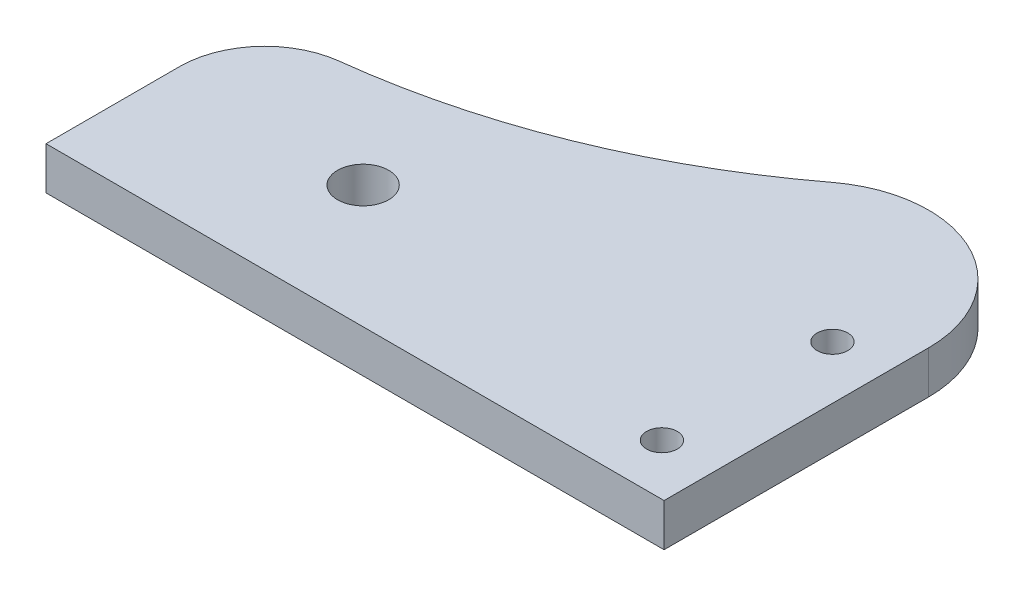
ISO-10303-21;
HEADER;
FILE_DESCRIPTION(('STEP AP214'),'2;1');
FILE_NAME('part.step','',(''),(''),'','','');
FILE_SCHEMA(('AUTOMOTIVE_DESIGN { 1 0 10303 214 1 1 1 1 }'));
ENDSEC;
DATA;
#1=APPLICATION_CONTEXT('core data for automotive mechanical design processes');
#2=APPLICATION_PROTOCOL_DEFINITION('international standard','automotive_design',2000,#1);
#3=PRODUCT_CONTEXT('',#1,'mechanical');
#4=PRODUCT('Part','Part','',(#3));
#5=PRODUCT_RELATED_PRODUCT_CATEGORY('part','',(#4));
#6=PRODUCT_DEFINITION_FORMATION('','',#4);
#7=PRODUCT_DEFINITION_CONTEXT('part definition',#1,'design');
#8=PRODUCT_DEFINITION('design','',#6,#7);
#9=PRODUCT_DEFINITION_SHAPE('','',#8);
#10=(LENGTH_UNIT() NAMED_UNIT(*) SI_UNIT(.MILLI.,.METRE.));
#11=(NAMED_UNIT(*) PLANE_ANGLE_UNIT() SI_UNIT($,.RADIAN.));
#12=(NAMED_UNIT(*) SI_UNIT($,.STERADIAN.) SOLID_ANGLE_UNIT());
#13=UNCERTAINTY_MEASURE_WITH_UNIT(LENGTH_MEASURE(1.E-05),#10,'distance_accuracy_value','');
#14=(GEOMETRIC_REPRESENTATION_CONTEXT(3) GLOBAL_UNCERTAINTY_ASSIGNED_CONTEXT((#13)) GLOBAL_UNIT_ASSIGNED_CONTEXT((#10,
#11,#12)) REPRESENTATION_CONTEXT('',''));
#15=CARTESIAN_POINT('',(0.,0.,0.));
#16=DIRECTION('',(0.,0.,1.));
#17=DIRECTION('',(1.,0.,0.));
#18=AXIS2_PLACEMENT_3D('',#15,#16,#17);
#19=CARTESIAN_POINT('',(92.075,6.35,0.));
#20=DIRECTION('',(-1.,0.,0.));
#21=DIRECTION('',(0.,0.,1.));
#22=AXIS2_PLACEMENT_3D('',#19,#20,#21);
#23=PLANE('',#22);
#24=DIRECTION('',(0.,0.,-1.));
#25=VECTOR('',#24,1.);
#26=CARTESIAN_POINT('',(92.075,0.,0.));
#27=LINE('',#26,#25);
#28=CARTESIAN_POINT('',(92.075,0.,0.));
#29=VERTEX_POINT('',#28);
#30=CARTESIAN_POINT('',(92.075,0.,-39.4041057354027));
#31=VERTEX_POINT('',#30);
#32=EDGE_CURVE('E128',#29,#31,#27,.T.);
#33=ORIENTED_EDGE('',*,*,#32,.T.);
#34=DIRECTION('',(0.,-1.,0.));
#35=VECTOR('',#34,1.);
#36=CARTESIAN_POINT('',(92.075,6.35,-39.4041057354027));
#37=LINE('',#36,#35);
#38=CARTESIAN_POINT('',(92.075,6.35,-39.4041057354027));
#39=VERTEX_POINT('',#38);
#40=EDGE_CURVE('E51',#31,#39,#37,.F.);
#41=ORIENTED_EDGE('',*,*,#40,.T.);
#42=DIRECTION('',(0.,0.,-1.));
#43=VECTOR('',#42,1.);
#44=CARTESIAN_POINT('',(92.075,6.35,0.));
#45=LINE('',#44,#43);
#46=CARTESIAN_POINT('',(92.075,6.35,0.));
#47=VERTEX_POINT('',#46);
#48=EDGE_CURVE('E139',#47,#39,#45,.T.);
#49=ORIENTED_EDGE('',*,*,#48,.F.);
#50=DIRECTION('',(0.,-1.,0.));
#51=VECTOR('',#50,1.);
#52=CARTESIAN_POINT('',(92.075,6.35,0.));
#53=LINE('',#52,#51);
#54=EDGE_CURVE('E118',#47,#29,#53,.T.);
#55=ORIENTED_EDGE('',*,*,#54,.T.);
#56=EDGE_LOOP('',(#33,#41,#49,#55));
#57=FACE_BOUND('',#56,.T.);
#58=ADVANCED_FACE('F42',(#57),#23,.F.);
#59=CARTESIAN_POINT('',(-1.54015257044048,6.35,-139.68901254903));
#60=DIRECTION('',(0.,-1.,0.));
#61=DIRECTION('',(0.,0.,-1.));
#62=AXIS2_PLACEMENT_3D('',#59,#60,#61);
#63=CYLINDRICAL_SURFACE('',#62,107.95);
#64=CARTESIAN_POINT('',(-1.54015257044048,6.35,-139.68901254903));
#65=DIRECTION('',(0.,-1.,0.));
#66=DIRECTION('',(0.,0.,-1.));
#67=AXIS2_PLACEMENT_3D('',#64,#65,#66);
#68=CIRCLE('',#67,107.95);
#69=CARTESIAN_POINT('',(63.5708370102407,6.35,-53.5858097292491));
#70=VERTEX_POINT('',#69);
#71=CARTESIAN_POINT('',(11.2010365715326,6.35,-32.493562089375));
#72=VERTEX_POINT('',#71);
#73=EDGE_CURVE('E107',#70,#72,#68,.T.);
#74=ORIENTED_EDGE('',*,*,#73,.F.);
#75=DIRECTION('',(0.,-1.,0.));
#76=VECTOR('',#75,1.);
#77=CARTESIAN_POINT('',(63.5708370102407,6.35,-53.5858097292491));
#78=LINE('',#77,#76);
#79=CARTESIAN_POINT('',(63.5708370102407,0.,-53.5858097292491));
#80=VERTEX_POINT('',#79);
#81=EDGE_CURVE('E153',#70,#80,#78,.T.);
#82=ORIENTED_EDGE('',*,*,#81,.T.);
#83=CARTESIAN_POINT('',(-1.54015257044048,0.,-139.68901254903));
#84=DIRECTION('',(0.,-1.,0.));
#85=DIRECTION('',(0.,0.,-1.));
#86=AXIS2_PLACEMENT_3D('',#83,#84,#85);
#87=CIRCLE('',#86,107.95);
#88=CARTESIAN_POINT('',(11.2010365715326,0.,-32.493562089375));
#89=VERTEX_POINT('',#88);
#90=EDGE_CURVE('E131',#80,#89,#87,.T.);
#91=ORIENTED_EDGE('',*,*,#90,.T.);
#92=DIRECTION('',(0.,-1.,0.));
#93=VECTOR('',#92,1.);
#94=CARTESIAN_POINT('',(11.2010365715326,6.35,-32.4935620893749));
#95=LINE('',#94,#93);
#96=EDGE_CURVE('E147',#89,#72,#95,.F.);
#97=ORIENTED_EDGE('',*,*,#96,.T.);
#98=EDGE_LOOP('',(#74,#82,#91,#97));
#99=FACE_BOUND('',#98,.T.);
#100=ADVANCED_FACE('F162',(#99),#63,.F.);
#101=CARTESIAN_POINT('',(0.,6.35,-31.75));
#102=DIRECTION('',(1.,0.,0.));
#103=DIRECTION('',(0.,0.,-1.));
#104=AXIS2_PLACEMENT_3D('',#101,#102,#103);
#105=PLANE('',#104);
#106=DIRECTION('',(0.,0.,1.));
#107=VECTOR('',#106,1.);
#108=CARTESIAN_POINT('',(0.,6.35,-31.75));
#109=LINE('',#108,#107);
#110=CARTESIAN_POINT('',(0.,6.35,-19.8823326235331));
#111=VERTEX_POINT('',#110);
#112=CARTESIAN_POINT('',(0.,6.35,0.));
#113=VERTEX_POINT('',#112);
#114=EDGE_CURVE('E95',#111,#113,#109,.T.);
#115=ORIENTED_EDGE('',*,*,#114,.F.);
#116=DIRECTION('',(0.,-1.,0.));
#117=VECTOR('',#116,1.);
#118=CARTESIAN_POINT('',(0.,6.35,-19.8823326235331));
#119=LINE('',#118,#117);
#120=CARTESIAN_POINT('',(0.,0.,-19.8823326235331));
#121=VERTEX_POINT('',#120);
#122=EDGE_CURVE('E117',#111,#121,#119,.T.);
#123=ORIENTED_EDGE('',*,*,#122,.T.);
#124=DIRECTION('',(0.,0.,1.));
#125=VECTOR('',#124,1.);
#126=CARTESIAN_POINT('',(0.,0.,-31.75));
#127=LINE('',#126,#125);
#128=CARTESIAN_POINT('',(0.,0.,0.));
#129=VERTEX_POINT('',#128);
#130=EDGE_CURVE('E113',#121,#129,#127,.T.);
#131=ORIENTED_EDGE('',*,*,#130,.T.);
#132=DIRECTION('',(0.,-1.,0.));
#133=VECTOR('',#132,1.);
#134=CARTESIAN_POINT('',(0.,6.35,0.));
#135=LINE('',#134,#133);
#136=EDGE_CURVE('E110',#113,#129,#135,.T.);
#137=ORIENTED_EDGE('',*,*,#136,.F.);
#138=EDGE_LOOP('',(#115,#123,#131,#137));
#139=FACE_BOUND('',#138,.T.);
#140=ADVANCED_FACE('F111',(#139),#105,.F.);
#141=CARTESIAN_POINT('',(0.,6.35,0.));
#142=DIRECTION('',(0.,0.,-1.));
#143=DIRECTION('',(-1.,0.,0.));
#144=AXIS2_PLACEMENT_3D('',#141,#142,#143);
#145=PLANE('',#144);
#146=DIRECTION('',(1.,0.,0.));
#147=VECTOR('',#146,1.);
#148=CARTESIAN_POINT('',(0.,0.,0.));
#149=LINE('',#148,#147);
#150=EDGE_CURVE('E137',#129,#29,#149,.T.);
#151=ORIENTED_EDGE('',*,*,#150,.T.);
#152=ORIENTED_EDGE('',*,*,#54,.F.);
#153=DIRECTION('',(1.,0.,0.));
#154=VECTOR('',#153,1.);
#155=CARTESIAN_POINT('',(0.,6.35,0.));
#156=LINE('',#155,#154);
#157=EDGE_CURVE('E99',#113,#47,#156,.T.);
#158=ORIENTED_EDGE('',*,*,#157,.F.);
#159=ORIENTED_EDGE('',*,*,#136,.T.);
#160=EDGE_LOOP('',(#151,#152,#158,#159));
#161=FACE_BOUND('',#160,.T.);
#162=ADVANCED_FACE('F120',(#161),#145,.F.);
#163=CARTESIAN_POINT('',(-1.54015257044048,6.35,-139.68901254903));
#164=DIRECTION('',(0.,-1.,0.));
#165=DIRECTION('',(0.,0.,-1.));
#166=AXIS2_PLACEMENT_3D('',#163,#164,#165);
#167=PLANE('',#166);
#168=CARTESIAN_POINT('',(28.956,6.35,-18.288));
#169=DIRECTION('',(0.,1.,0.));
#170=DIRECTION('',(0.,0.,1.));
#171=AXIS2_PLACEMENT_3D('',#168,#169,#170);
#172=CIRCLE('',#171,3.81);
#173=CARTESIAN_POINT('',(28.956,6.35,-14.478));
#174=VERTEX_POINT('',#173);
#175=EDGE_CURVE('E209',#174,#174,#172,.T.);
#176=ORIENTED_EDGE('',*,*,#175,.F.);
#177=EDGE_LOOP('',(#176));
#178=FACE_BOUND('',#177,.T.);
#179=CARTESIAN_POINT('',(84.1375,6.35,-7.62));
#180=DIRECTION('',(0.,1.,0.));
#181=DIRECTION('',(0.,0.,1.));
#182=AXIS2_PLACEMENT_3D('',#179,#180,#181);
#183=CIRCLE('',#182,2.28599999999999);
#184=CARTESIAN_POINT('',(84.1375,6.35,-5.334));
#185=VERTEX_POINT('',#184);
#186=EDGE_CURVE('E219',#185,#185,#183,.T.);
#187=ORIENTED_EDGE('',*,*,#186,.F.);
#188=EDGE_LOOP('',(#187));
#189=FACE_BOUND('',#188,.T.);
#190=CARTESIAN_POINT('',(84.1375,6.35,-33.02));
#191=DIRECTION('',(0.,1.,0.));
#192=DIRECTION('',(0.,0.,1.));
#193=AXIS2_PLACEMENT_3D('',#190,#191,#192);
#194=CIRCLE('',#193,2.28599999999999);
#195=CARTESIAN_POINT('',(84.1375,6.35,-30.734));
#196=VERTEX_POINT('',#195);
#197=EDGE_CURVE('E223',#196,#196,#194,.T.);
#198=ORIENTED_EDGE('',*,*,#197,.F.);
#199=EDGE_LOOP('',(#198));
#200=FACE_BOUND('',#199,.T.);
#201=ORIENTED_EDGE('',*,*,#48,.T.);
#202=CARTESIAN_POINT('',(74.295,6.35,-39.4041057354027));
#203=DIRECTION('',(0.,-1.,0.));
#204=DIRECTION('',(0.,0.,-1.));
#205=AXIS2_PLACEMENT_3D('',#202,#203,#204);
#206=CIRCLE('',#205,17.78);
#207=EDGE_CURVE('E11',#39,#70,#206,.F.);
#208=ORIENTED_EDGE('',*,*,#207,.T.);
#209=ORIENTED_EDGE('',*,*,#73,.T.);
#210=CARTESIAN_POINT('',(12.7,6.35,-19.8823326235331));
#211=DIRECTION('',(0.,-1.,0.));
#212=DIRECTION('',(0.,0.,-1.));
#213=AXIS2_PLACEMENT_3D('',#210,#211,#212);
#214=CIRCLE('',#213,12.7);
#215=EDGE_CURVE('E102',#72,#111,#214,.F.);
#216=ORIENTED_EDGE('',*,*,#215,.T.);
#217=ORIENTED_EDGE('',*,*,#114,.T.);
#218=ORIENTED_EDGE('',*,*,#157,.T.);
#219=EDGE_LOOP('',(#201,#208,#209,#216,#217,#218));
#220=FACE_BOUND('',#219,.T.);
#221=ADVANCED_FACE('F97',(#178,#189,#200,#220),#167,.F.);
#222=CARTESIAN_POINT('',(-1.54015257044048,0.,-139.68901254903));
#223=DIRECTION('',(0.,-1.,0.));
#224=DIRECTION('',(0.,0.,-1.));
#225=AXIS2_PLACEMENT_3D('',#222,#223,#224);
#226=PLANE('',#225);
#227=CARTESIAN_POINT('',(28.956,0.,-18.288));
#228=DIRECTION('',(0.,1.,0.));
#229=DIRECTION('',(0.,0.,1.));
#230=AXIS2_PLACEMENT_3D('',#227,#228,#229);
#231=CIRCLE('',#230,3.81);
#232=CARTESIAN_POINT('',(28.956,0.,-14.478));
#233=VERTEX_POINT('',#232);
#234=EDGE_CURVE('E206',#233,#233,#231,.T.);
#235=ORIENTED_EDGE('',*,*,#234,.T.);
#236=EDGE_LOOP('',(#235));
#237=FACE_BOUND('',#236,.T.);
#238=CARTESIAN_POINT('',(84.1375,0.,-7.62));
#239=DIRECTION('',(0.,1.,0.));
#240=DIRECTION('',(0.,0.,1.));
#241=AXIS2_PLACEMENT_3D('',#238,#239,#240);
#242=CIRCLE('',#241,2.28599999999999);
#243=CARTESIAN_POINT('',(84.1375,0.,-5.334));
#244=VERTEX_POINT('',#243);
#245=EDGE_CURVE('E132',#244,#244,#242,.T.);
#246=ORIENTED_EDGE('',*,*,#245,.T.);
#247=EDGE_LOOP('',(#246));
#248=FACE_BOUND('',#247,.T.);
#249=CARTESIAN_POINT('',(84.1375,0.,-33.02));
#250=DIRECTION('',(0.,1.,0.));
#251=DIRECTION('',(0.,0.,1.));
#252=AXIS2_PLACEMENT_3D('',#249,#250,#251);
#253=CIRCLE('',#252,2.28599999999999);
#254=CARTESIAN_POINT('',(84.1375,0.,-30.734));
#255=VERTEX_POINT('',#254);
#256=EDGE_CURVE('E213',#255,#255,#253,.T.);
#257=ORIENTED_EDGE('',*,*,#256,.T.);
#258=EDGE_LOOP('',(#257));
#259=FACE_BOUND('',#258,.T.);
#260=ORIENTED_EDGE('',*,*,#90,.F.);
#261=CARTESIAN_POINT('',(74.295,0.,-39.4041057354027));
#262=DIRECTION('',(0.,-1.,0.));
#263=DIRECTION('',(0.,0.,-1.));
#264=AXIS2_PLACEMENT_3D('',#261,#262,#263);
#265=CIRCLE('',#264,17.78);
#266=EDGE_CURVE('E65',#80,#31,#265,.T.);
#267=ORIENTED_EDGE('',*,*,#266,.T.);
#268=ORIENTED_EDGE('',*,*,#32,.F.);
#269=ORIENTED_EDGE('',*,*,#150,.F.);
#270=ORIENTED_EDGE('',*,*,#130,.F.);
#271=CARTESIAN_POINT('',(12.7,0.,-19.8823326235331));
#272=DIRECTION('',(0.,-1.,0.));
#273=DIRECTION('',(0.,0.,-1.));
#274=AXIS2_PLACEMENT_3D('',#271,#272,#273);
#275=CIRCLE('',#274,12.7);
#276=EDGE_CURVE('E143',#121,#89,#275,.T.);
#277=ORIENTED_EDGE('',*,*,#276,.T.);
#278=EDGE_LOOP('',(#260,#267,#268,#269,#270,#277));
#279=FACE_BOUND('',#278,.T.);
#280=ADVANCED_FACE('F165',(#237,#248,#259,#279),#226,.T.);
#281=CARTESIAN_POINT('',(12.7,6.35,-19.8823326235331));
#282=DIRECTION('',(0.,-1.,0.));
#283=DIRECTION('',(0.,0.,-1.));
#284=AXIS2_PLACEMENT_3D('',#281,#282,#283);
#285=CYLINDRICAL_SURFACE('',#284,12.7);
#286=ORIENTED_EDGE('',*,*,#215,.F.);
#287=ORIENTED_EDGE('',*,*,#96,.F.);
#288=ORIENTED_EDGE('',*,*,#276,.F.);
#289=ORIENTED_EDGE('',*,*,#122,.F.);
#290=EDGE_LOOP('',(#286,#287,#288,#289));
#291=FACE_BOUND('',#290,.T.);
#292=ADVANCED_FACE('F168',(#291),#285,.T.);
#293=CARTESIAN_POINT('',(84.1375,0.,-33.02));
#294=DIRECTION('',(0.,1.,0.));
#295=DIRECTION('',(0.,0.,1.));
#296=AXIS2_PLACEMENT_3D('',#293,#294,#295);
#297=CYLINDRICAL_SURFACE('',#296,2.28599999999999);
#298=ORIENTED_EDGE('',*,*,#256,.F.);
#299=EDGE_LOOP('',(#298));
#300=FACE_BOUND('',#299,.T.);
#301=ORIENTED_EDGE('',*,*,#197,.T.);
#302=EDGE_LOOP('',(#301));
#303=FACE_BOUND('',#302,.T.);
#304=ADVANCED_FACE('F170',(#300,#303),#297,.F.);
#305=CARTESIAN_POINT('',(84.1375,0.,-7.62));
#306=DIRECTION('',(0.,1.,0.));
#307=DIRECTION('',(0.,0.,1.));
#308=AXIS2_PLACEMENT_3D('',#305,#306,#307);
#309=CYLINDRICAL_SURFACE('',#308,2.28599999999999);
#310=ORIENTED_EDGE('',*,*,#245,.F.);
#311=EDGE_LOOP('',(#310));
#312=FACE_BOUND('',#311,.T.);
#313=ORIENTED_EDGE('',*,*,#186,.T.);
#314=EDGE_LOOP('',(#313));
#315=FACE_BOUND('',#314,.T.);
#316=ADVANCED_FACE('F175',(#312,#315),#309,.F.);
#317=CARTESIAN_POINT('',(28.956,0.,-18.288));
#318=DIRECTION('',(0.,1.,0.));
#319=DIRECTION('',(0.,0.,1.));
#320=AXIS2_PLACEMENT_3D('',#317,#318,#319);
#321=CYLINDRICAL_SURFACE('',#320,3.81);
#322=ORIENTED_EDGE('',*,*,#234,.F.);
#323=EDGE_LOOP('',(#322));
#324=FACE_BOUND('',#323,.T.);
#325=ORIENTED_EDGE('',*,*,#175,.T.);
#326=EDGE_LOOP('',(#325));
#327=FACE_BOUND('',#326,.T.);
#328=ADVANCED_FACE('F196',(#324,#327),#321,.F.);
#329=CARTESIAN_POINT('',(74.295,6.35,-39.4041057354027));
#330=DIRECTION('',(0.,-1.,0.));
#331=DIRECTION('',(0.,0.,-1.));
#332=AXIS2_PLACEMENT_3D('',#329,#330,#331);
#333=CYLINDRICAL_SURFACE('',#332,17.78);
#334=ORIENTED_EDGE('',*,*,#207,.F.);
#335=ORIENTED_EDGE('',*,*,#40,.F.);
#336=ORIENTED_EDGE('',*,*,#266,.F.);
#337=ORIENTED_EDGE('',*,*,#81,.F.);
#338=EDGE_LOOP('',(#334,#335,#336,#337));
#339=FACE_BOUND('',#338,.T.);
#340=ADVANCED_FACE('F44',(#339),#333,.T.);
#341=CLOSED_SHELL('',(#58,#100,#140,#162,#221,#280,#292,#304,#316,#328,#340));
#342=MANIFOLD_SOLID_BREP('B2',#341);
#343=ADVANCED_BREP_SHAPE_REPRESENTATION('',(#18,#342),#14);
#344=SHAPE_DEFINITION_REPRESENTATION(#9,#343);
ENDSEC;
END-ISO-10303-21;
